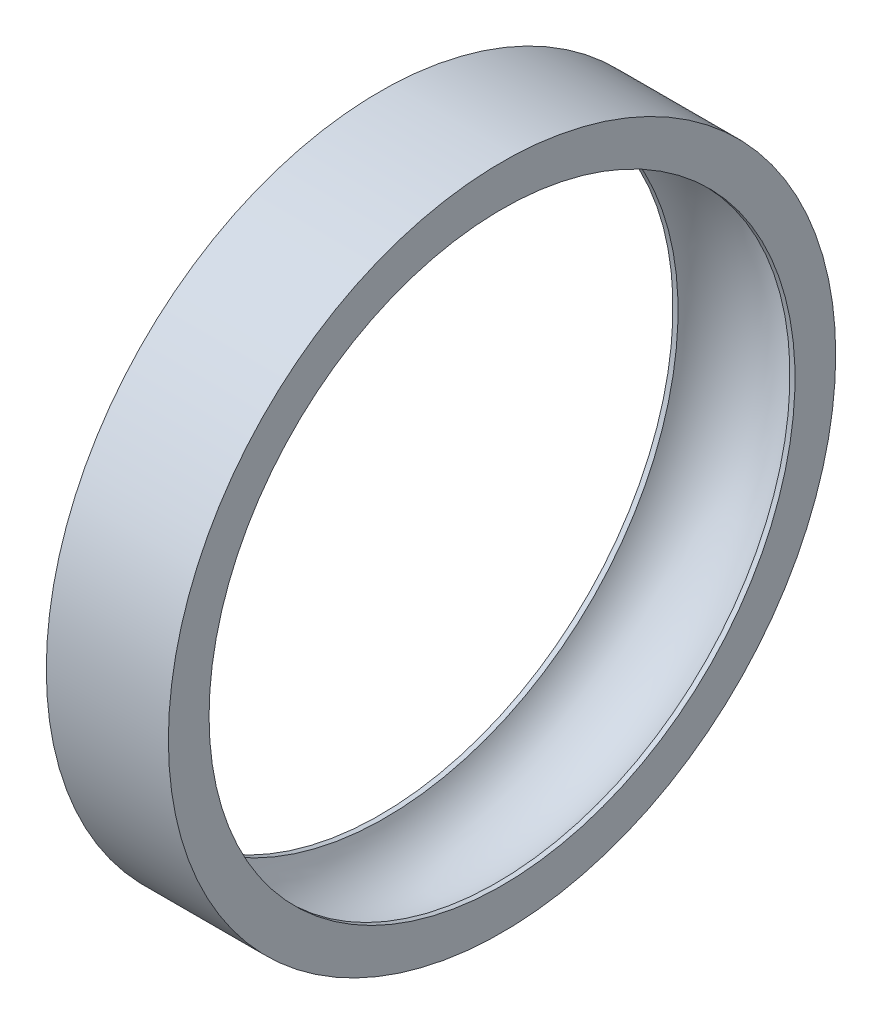
ISO-10303-21;
HEADER;
FILE_DESCRIPTION(('STEP AP214'),'2;1');
FILE_NAME('part.step','',(''),(''),'','','');
FILE_SCHEMA(('AUTOMOTIVE_DESIGN { 1 0 10303 214 1 1 1 1 }'));
ENDSEC;
DATA;
#1=APPLICATION_CONTEXT('core data for automotive mechanical design processes');
#2=APPLICATION_PROTOCOL_DEFINITION('international standard','automotive_design',2000,#1);
#3=PRODUCT_CONTEXT('',#1,'mechanical');
#4=PRODUCT('Part','Part','',(#3));
#5=PRODUCT_RELATED_PRODUCT_CATEGORY('part','',(#4));
#6=PRODUCT_DEFINITION_FORMATION('','',#4);
#7=PRODUCT_DEFINITION_CONTEXT('part definition',#1,'design');
#8=PRODUCT_DEFINITION('design','',#6,#7);
#9=PRODUCT_DEFINITION_SHAPE('','',#8);
#10=(LENGTH_UNIT() NAMED_UNIT(*) SI_UNIT(.MILLI.,.METRE.));
#11=(NAMED_UNIT(*) PLANE_ANGLE_UNIT() SI_UNIT($,.RADIAN.));
#12=(NAMED_UNIT(*) SI_UNIT($,.STERADIAN.) SOLID_ANGLE_UNIT());
#13=UNCERTAINTY_MEASURE_WITH_UNIT(LENGTH_MEASURE(1.E-05),#10,'distance_accuracy_value','');
#14=(GEOMETRIC_REPRESENTATION_CONTEXT(3) GLOBAL_UNCERTAINTY_ASSIGNED_CONTEXT((#13)) GLOBAL_UNIT_ASSIGNED_CONTEXT((#10,
#11,#12)) REPRESENTATION_CONTEXT('',''));
#15=CARTESIAN_POINT('',(0.,0.,0.));
#16=DIRECTION('',(0.,0.,1.));
#17=DIRECTION('',(1.,0.,0.));
#18=AXIS2_PLACEMENT_3D('',#15,#16,#17);
#19=CARTESIAN_POINT('',(0.,0.,0.));
#20=DIRECTION('',(-1.,0.,0.));
#21=DIRECTION('',(0.,0.,1.));
#22=AXIS2_PLACEMENT_3D('',#19,#20,#21);
#23=CYLINDRICAL_SURFACE('',#22,104.3766);
#24=CARTESIAN_POINT('',(-19.9297362617553,0.,0.));
#25=DIRECTION('',(-1.,0.,0.));
#26=DIRECTION('',(0.,0.,1.));
#27=AXIS2_PLACEMENT_3D('',#24,#25,#26);
#28=CIRCLE('',#27,104.3766);
#29=CARTESIAN_POINT('',(-19.9297362617553,0.,104.3766));
#30=VERTEX_POINT('',#29);
#31=EDGE_CURVE('E10',#30,#30,#28,.T.);
#32=ORIENTED_EDGE('',*,*,#31,.F.);
#33=EDGE_LOOP('',(#32));
#34=FACE_BOUND('',#33,.T.);
#35=CARTESIAN_POINT('',(-21.745125,0.,0.));
#36=DIRECTION('',(-1.,0.,0.));
#37=DIRECTION('',(0.,0.,1.));
#38=AXIS2_PLACEMENT_3D('',#35,#36,#37);
#39=CIRCLE('',#38,104.3766);
#40=CARTESIAN_POINT('',(-21.745125,0.,104.3766));
#41=VERTEX_POINT('',#40);
#42=EDGE_CURVE('E54',#41,#41,#39,.T.);
#43=ORIENTED_EDGE('',*,*,#42,.T.);
#44=EDGE_LOOP('',(#43));
#45=FACE_BOUND('',#44,.T.);
#46=ADVANCED_FACE('F32',(#34,#45),#23,.F.);
#47=CARTESIAN_POINT('',(0.,0.,0.));
#48=DIRECTION('',(-1.,0.,0.));
#49=DIRECTION('',(0.,0.,1.));
#50=AXIS2_PLACEMENT_3D('',#47,#48,#49);
#51=TOROIDAL_SURFACE('',#50,95.67855,21.745125);
#52=CARTESIAN_POINT('',(19.9297362617553,0.,0.));
#53=DIRECTION('',(-1.,0.,0.));
#54=DIRECTION('',(0.,0.,1.));
#55=AXIS2_PLACEMENT_3D('',#52,#53,#54);
#56=CIRCLE('',#55,104.3766);
#57=CARTESIAN_POINT('',(19.9297362617553,0.,104.3766));
#58=VERTEX_POINT('',#57);
#59=EDGE_CURVE('E38',#58,#58,#56,.T.);
#60=ORIENTED_EDGE('',*,*,#59,.F.);
#61=EDGE_LOOP('',(#60));
#62=FACE_BOUND('',#61,.T.);
#63=ORIENTED_EDGE('',*,*,#31,.T.);
#64=EDGE_LOOP('',(#63));
#65=FACE_BOUND('',#64,.T.);
#66=ADVANCED_FACE('F79',(#62,#65),#51,.F.);
#67=CARTESIAN_POINT('',(0.,0.,0.));
#68=DIRECTION('',(-1.,0.,0.));
#69=DIRECTION('',(0.,0.,1.));
#70=AXIS2_PLACEMENT_3D('',#67,#68,#69);
#71=CYLINDRICAL_SURFACE('',#70,104.3766);
#72=CARTESIAN_POINT('',(21.745125,0.,0.));
#73=DIRECTION('',(-1.,0.,0.));
#74=DIRECTION('',(0.,0.,1.));
#75=AXIS2_PLACEMENT_3D('',#72,#73,#74);
#76=CIRCLE('',#75,104.3766);
#77=CARTESIAN_POINT('',(21.745125,0.,104.3766));
#78=VERTEX_POINT('',#77);
#79=EDGE_CURVE('E42',#78,#78,#76,.T.);
#80=ORIENTED_EDGE('',*,*,#79,.F.);
#81=EDGE_LOOP('',(#80));
#82=FACE_BOUND('',#81,.T.);
#83=ORIENTED_EDGE('',*,*,#59,.T.);
#84=EDGE_LOOP('',(#83));
#85=FACE_BOUND('',#84,.T.);
#86=ADVANCED_FACE('F74',(#82,#85),#71,.F.);
#87=CARTESIAN_POINT('',(21.745125,118.87335,0.));
#88=DIRECTION('',(-1.,0.,0.));
#89=DIRECTION('',(0.,0.,1.));
#90=AXIS2_PLACEMENT_3D('',#87,#88,#89);
#91=PLANE('',#90);
#92=CARTESIAN_POINT('',(21.745125,0.,0.));
#93=DIRECTION('',(-1.,0.,0.));
#94=DIRECTION('',(0.,0.,1.));
#95=AXIS2_PLACEMENT_3D('',#92,#93,#94);
#96=CIRCLE('',#95,118.87335);
#97=CARTESIAN_POINT('',(21.745125,0.,118.87335));
#98=VERTEX_POINT('',#97);
#99=EDGE_CURVE('E46',#98,#98,#96,.T.);
#100=ORIENTED_EDGE('',*,*,#99,.F.);
#101=EDGE_LOOP('',(#100));
#102=FACE_BOUND('',#101,.T.);
#103=ORIENTED_EDGE('',*,*,#79,.T.);
#104=EDGE_LOOP('',(#103));
#105=FACE_BOUND('',#104,.T.);
#106=ADVANCED_FACE('F68',(#102,#105),#91,.F.);
#107=CARTESIAN_POINT('',(0.,0.,0.));
#108=DIRECTION('',(-1.,0.,0.));
#109=DIRECTION('',(0.,0.,1.));
#110=AXIS2_PLACEMENT_3D('',#107,#108,#109);
#111=CYLINDRICAL_SURFACE('',#110,118.87335);
#112=CARTESIAN_POINT('',(-21.745125,0.,0.));
#113=DIRECTION('',(-1.,0.,0.));
#114=DIRECTION('',(0.,0.,1.));
#115=AXIS2_PLACEMENT_3D('',#112,#113,#114);
#116=CIRCLE('',#115,118.87335);
#117=CARTESIAN_POINT('',(-21.745125,0.,118.87335));
#118=VERTEX_POINT('',#117);
#119=EDGE_CURVE('E51',#118,#118,#116,.T.);
#120=ORIENTED_EDGE('',*,*,#119,.F.);
#121=EDGE_LOOP('',(#120));
#122=FACE_BOUND('',#121,.T.);
#123=ORIENTED_EDGE('',*,*,#99,.T.);
#124=EDGE_LOOP('',(#123));
#125=FACE_BOUND('',#124,.T.);
#126=ADVANCED_FACE('F62',(#122,#125),#111,.T.);
#127=CARTESIAN_POINT('',(-21.745125,104.3766,0.));
#128=DIRECTION('',(1.,0.,0.));
#129=DIRECTION('',(0.,0.,-1.));
#130=AXIS2_PLACEMENT_3D('',#127,#128,#129);
#131=PLANE('',#130);
#132=ORIENTED_EDGE('',*,*,#42,.F.);
#133=EDGE_LOOP('',(#132));
#134=FACE_BOUND('',#133,.T.);
#135=ORIENTED_EDGE('',*,*,#119,.T.);
#136=EDGE_LOOP('',(#135));
#137=FACE_BOUND('',#136,.T.);
#138=ADVANCED_FACE('F59',(#134,#137),#131,.F.);
#139=CLOSED_SHELL('',(#46,#66,#86,#106,#126,#138));
#140=MANIFOLD_SOLID_BREP('B2',#139);
#141=ADVANCED_BREP_SHAPE_REPRESENTATION('',(#18,#140),#14);
#142=SHAPE_DEFINITION_REPRESENTATION(#9,#141);
ENDSEC;
END-ISO-10303-21;
